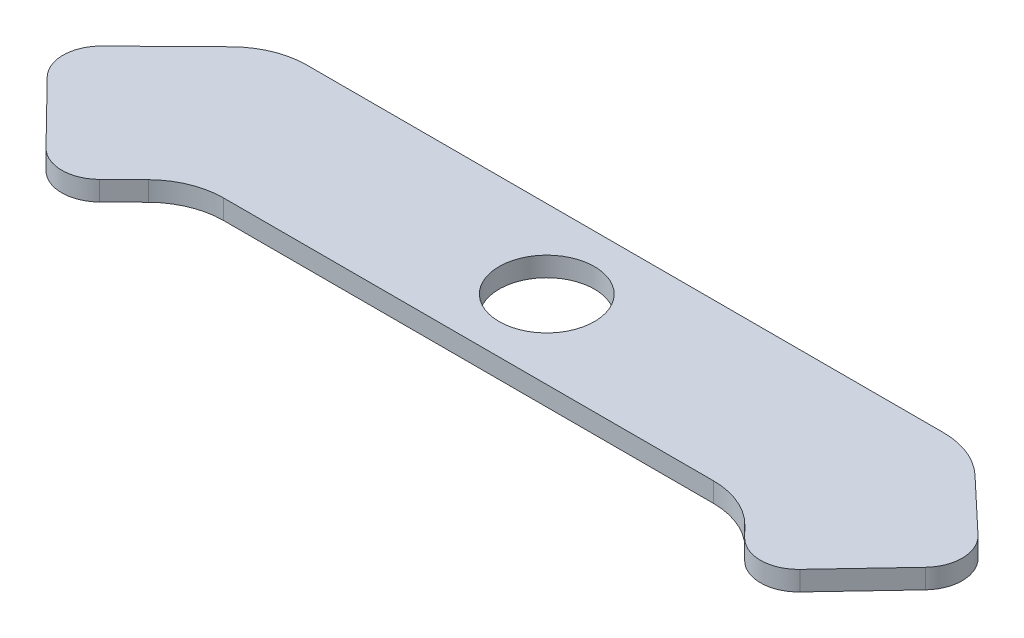
ISO-10303-21;
HEADER;
FILE_DESCRIPTION(('STEP AP214'),'2;1');
FILE_NAME('part.step','',(''),(''),'','','');
FILE_SCHEMA(('AUTOMOTIVE_DESIGN { 1 0 10303 214 1 1 1 1 }'));
ENDSEC;
DATA;
#1=APPLICATION_CONTEXT('core data for automotive mechanical design processes');
#2=APPLICATION_PROTOCOL_DEFINITION('international standard','automotive_design',2000,#1);
#3=PRODUCT_CONTEXT('',#1,'mechanical');
#4=PRODUCT('Part','Part','',(#3));
#5=PRODUCT_RELATED_PRODUCT_CATEGORY('part','',(#4));
#6=PRODUCT_DEFINITION_FORMATION('','',#4);
#7=PRODUCT_DEFINITION_CONTEXT('part definition',#1,'design');
#8=PRODUCT_DEFINITION('design','',#6,#7);
#9=PRODUCT_DEFINITION_SHAPE('','',#8);
#10=(LENGTH_UNIT() NAMED_UNIT(*) SI_UNIT(.MILLI.,.METRE.));
#11=(NAMED_UNIT(*) PLANE_ANGLE_UNIT() SI_UNIT($,.RADIAN.));
#12=(NAMED_UNIT(*) SI_UNIT($,.STERADIAN.) SOLID_ANGLE_UNIT());
#13=UNCERTAINTY_MEASURE_WITH_UNIT(LENGTH_MEASURE(1.E-05),#10,'distance_accuracy_value','');
#14=(GEOMETRIC_REPRESENTATION_CONTEXT(3) GLOBAL_UNCERTAINTY_ASSIGNED_CONTEXT((#13)) GLOBAL_UNIT_ASSIGNED_CONTEXT((#10,
#11,#12)) REPRESENTATION_CONTEXT('',''));
#15=CARTESIAN_POINT('',(0.,0.,0.));
#16=DIRECTION('',(0.,0.,1.));
#17=DIRECTION('',(1.,0.,0.));
#18=AXIS2_PLACEMENT_3D('',#15,#16,#17);
#19=CARTESIAN_POINT('',(34.4461233765753,2.,8.73526015993933));
#20=DIRECTION('',(0.,-1.,0.));
#21=DIRECTION('',(0.,0.,-1.));
#22=AXIS2_PLACEMENT_3D('',#19,#20,#21);
#23=CYLINDRICAL_SURFACE('',#22,3.89449955634084);
#24=CARTESIAN_POINT('',(34.4461233765753,0.,8.73526015993933));
#25=DIRECTION('',(0.,1.,0.));
#26=DIRECTION('',(0.,0.,1.));
#27=AXIS2_PLACEMENT_3D('',#24,#25,#26);
#28=CIRCLE('',#27,3.89449955634084);
#29=CARTESIAN_POINT('',(37.2780702909554,0.,11.4086855784748));
#30=VERTEX_POINT('',#29);
#31=CARTESIAN_POINT('',(31.6648943919165,0.,11.4614098493792));
#32=VERTEX_POINT('',#31);
#33=EDGE_CURVE('E246',#30,#32,#28,.F.);
#34=ORIENTED_EDGE('',*,*,#33,.F.);
#35=DIRECTION('',(0.,-1.,0.));
#36=VECTOR('',#35,1.);
#37=CARTESIAN_POINT('',(37.2780702909554,2.,11.4086855784748));
#38=LINE('',#37,#36);
#39=CARTESIAN_POINT('',(37.2780702909554,2.,11.4086855784748));
#40=VERTEX_POINT('',#39);
#41=EDGE_CURVE('E11',#40,#30,#38,.T.);
#42=ORIENTED_EDGE('',*,*,#41,.F.);
#43=CARTESIAN_POINT('',(34.4461233765753,2.,8.73526015993933));
#44=DIRECTION('',(0.,1.,0.));
#45=DIRECTION('',(0.,0.,1.));
#46=AXIS2_PLACEMENT_3D('',#43,#44,#45);
#47=CIRCLE('',#46,3.89449955634084);
#48=CARTESIAN_POINT('',(31.6648943919165,2.,11.4614098493792));
#49=VERTEX_POINT('',#48);
#50=EDGE_CURVE('E375',#40,#49,#47,.F.);
#51=ORIENTED_EDGE('',*,*,#50,.T.);
#52=DIRECTION('',(0.,-1.,0.));
#53=VECTOR('',#52,1.);
#54=CARTESIAN_POINT('',(31.6648943919165,2.,11.4614098493792));
#55=LINE('',#54,#53);
#56=EDGE_CURVE('E119',#49,#32,#55,.T.);
#57=ORIENTED_EDGE('',*,*,#56,.T.);
#58=EDGE_LOOP('',(#34,#42,#51,#57));
#59=FACE_BOUND('',#58,.T.);
#60=ADVANCED_FACE('F43',(#59),#23,.T.);
#61=CARTESIAN_POINT('',(25.4064211540455,2.,23.9842674177068));
#62=DIRECTION('',(-0.727165807419162,0.,-0.686461862393271));
#63=DIRECTION('',(-0.686461862393271,0.,0.727165807419162));
#64=AXIS2_PLACEMENT_3D('',#61,#62,#63);
#65=PLANE('',#64);
#66=DIRECTION('',(0.686461862393271,0.,-0.727165807419162));
#67=VECTOR('',#66,1.);
#68=CARTESIAN_POINT('',(25.4064211540455,0.,23.9842674177068));
#69=LINE('',#68,#67);
#70=CARTESIAN_POINT('',(43.5001435988416,0.,4.8176727216554));
#71=VERTEX_POINT('',#70);
#72=EDGE_CURVE('E243',#30,#71,#69,.T.);
#73=ORIENTED_EDGE('',*,*,#72,.T.);
#74=DIRECTION('',(0.,-1.,0.));
#75=VECTOR('',#74,1.);
#76=CARTESIAN_POINT('',(43.5001435988416,2.,4.8176727216554));
#77=LINE('',#76,#75);
#78=CARTESIAN_POINT('',(43.5001435988416,2.,4.8176727216554));
#79=VERTEX_POINT('',#78);
#80=EDGE_CURVE('E53',#79,#71,#77,.T.);
#81=ORIENTED_EDGE('',*,*,#80,.F.);
#82=DIRECTION('',(0.686461862393271,0.,-0.727165807419162));
#83=VECTOR('',#82,1.);
#84=CARTESIAN_POINT('',(25.4064211540455,2.,23.9842674177068));
#85=LINE('',#84,#83);
#86=EDGE_CURVE('E378',#40,#79,#85,.T.);
#87=ORIENTED_EDGE('',*,*,#86,.F.);
#88=ORIENTED_EDGE('',*,*,#41,.T.);
#89=EDGE_LOOP('',(#73,#81,#87,#88));
#90=FACE_BOUND('',#89,.T.);
#91=ADVANCED_FACE('F244',(#90),#65,.F.);
#92=CARTESIAN_POINT('',(40.6681966844614,2.,2.14424730311987));
#93=DIRECTION('',(0.,-1.,0.));
#94=DIRECTION('',(0.,0.,-1.));
#95=AXIS2_PLACEMENT_3D('',#92,#93,#94);
#96=CYLINDRICAL_SURFACE('',#95,3.89449955634084);
#97=CARTESIAN_POINT('',(40.6681966844614,0.,2.14424730311987));
#98=DIRECTION('',(0.,1.,0.));
#99=DIRECTION('',(0.,0.,1.));
#100=AXIS2_PLACEMENT_3D('',#97,#98,#99);
#101=CIRCLE('',#100,3.89449955634084);
#102=CARTESIAN_POINT('',(43.3416221029969,0.,-0.687699611260275));
#103=VERTEX_POINT('',#102);
#104=EDGE_CURVE('E237',#103,#71,#101,.F.);
#105=ORIENTED_EDGE('',*,*,#104,.F.);
#106=DIRECTION('',(0.,-1.,0.));
#107=VECTOR('',#106,1.);
#108=CARTESIAN_POINT('',(43.3416221029969,2.,-0.687699611260275));
#109=LINE('',#108,#107);
#110=CARTESIAN_POINT('',(43.3416221029969,2.,-0.687699611260275));
#111=VERTEX_POINT('',#110);
#112=EDGE_CURVE('E227',#111,#103,#109,.T.);
#113=ORIENTED_EDGE('',*,*,#112,.F.);
#114=CARTESIAN_POINT('',(40.6681966844614,2.,2.14424730311987));
#115=DIRECTION('',(0.,1.,0.));
#116=DIRECTION('',(0.,0.,1.));
#117=AXIS2_PLACEMENT_3D('',#114,#115,#116);
#118=CIRCLE('',#117,3.89449955634084);
#119=EDGE_CURVE('E240',#111,#79,#118,.F.);
#120=ORIENTED_EDGE('',*,*,#119,.T.);
#121=ORIENTED_EDGE('',*,*,#80,.T.);
#122=EDGE_LOOP('',(#105,#113,#120,#121));
#123=FACE_BOUND('',#122,.T.);
#124=ADVANCED_FACE('F235',(#123),#96,.T.);
#125=CARTESIAN_POINT('',(20.7671478633316,2.,-21.9985416104315));
#126=DIRECTION('',(0.68646186239327,0.,-0.727165807419163));
#127=DIRECTION('',(-0.727165807419163,0.,-0.68646186239327));
#128=AXIS2_PLACEMENT_3D('',#125,#126,#127);
#129=PLANE('',#128);
#130=DIRECTION('',(0.727165807419163,0.,0.68646186239327));
#131=VECTOR('',#130,1.);
#132=CARTESIAN_POINT('',(20.7671478633316,0.,-21.9985416104315));
#133=LINE('',#132,#131);
#134=CARTESIAN_POINT('',(37.8468508370623,0.,-5.87489471608208));
#135=VERTEX_POINT('',#134);
#136=EDGE_CURVE('E251',#135,#103,#133,.T.);
#137=ORIENTED_EDGE('',*,*,#136,.F.);
#138=DIRECTION('',(0.,-1.,0.));
#139=VECTOR('',#138,1.);
#140=CARTESIAN_POINT('',(37.8468508370623,2.,-5.87489471608208));
#141=LINE('',#140,#139);
#142=CARTESIAN_POINT('',(37.8468508370623,2.,-5.87489471608208));
#143=VERTEX_POINT('',#142);
#144=EDGE_CURVE('E224',#143,#135,#141,.T.);
#145=ORIENTED_EDGE('',*,*,#144,.F.);
#146=DIRECTION('',(0.727165807419163,0.,0.68646186239327));
#147=VECTOR('',#146,1.);
#148=CARTESIAN_POINT('',(20.7671478633316,2.,-21.9985416104315));
#149=LINE('',#148,#147);
#150=EDGE_CURVE('E385',#143,#111,#149,.T.);
#151=ORIENTED_EDGE('',*,*,#150,.T.);
#152=ORIENTED_EDGE('',*,*,#112,.T.);
#153=EDGE_LOOP('',(#137,#145,#151,#152));
#154=FACE_BOUND('',#153,.T.);
#155=ADVANCED_FACE('F316',(#154),#129,.T.);
#156=CARTESIAN_POINT('',(32.5,2.,-0.211000887330933));
#157=DIRECTION('',(0.,-1.,0.));
#158=DIRECTION('',(0.,0.,-1.));
#159=AXIS2_PLACEMENT_3D('',#156,#157,#158);
#160=CYLINDRICAL_SURFACE('',#159,7.78899911266906);
#161=CARTESIAN_POINT('',(32.5,0.,-0.211000887330933));
#162=DIRECTION('',(0.,1.,0.));
#163=DIRECTION('',(0.,0.,1.));
#164=AXIS2_PLACEMENT_3D('',#161,#162,#163);
#165=CIRCLE('',#164,7.78899911266906);
#166=CARTESIAN_POINT('',(32.5,0.,-7.99999999999999));
#167=VERTEX_POINT('',#166);
#168=EDGE_CURVE('E255',#167,#135,#165,.F.);
#169=ORIENTED_EDGE('',*,*,#168,.F.);
#170=DIRECTION('',(0.,-1.,0.));
#171=VECTOR('',#170,1.);
#172=CARTESIAN_POINT('',(32.5,2.,-7.99999999999999));
#173=LINE('',#172,#171);
#174=CARTESIAN_POINT('',(32.5,2.,-7.99999999999999));
#175=VERTEX_POINT('',#174);
#176=EDGE_CURVE('E221',#175,#167,#173,.T.);
#177=ORIENTED_EDGE('',*,*,#176,.F.);
#178=CARTESIAN_POINT('',(32.5,2.,-0.211000887330933));
#179=DIRECTION('',(0.,1.,0.));
#180=DIRECTION('',(0.,0.,1.));
#181=AXIS2_PLACEMENT_3D('',#178,#179,#180);
#182=CIRCLE('',#181,7.78899911266906);
#183=EDGE_CURVE('E389',#175,#143,#182,.F.);
#184=ORIENTED_EDGE('',*,*,#183,.T.);
#185=ORIENTED_EDGE('',*,*,#144,.T.);
#186=EDGE_LOOP('',(#169,#177,#184,#185));
#187=FACE_BOUND('',#186,.T.);
#188=ADVANCED_FACE('F319',(#187),#160,.T.);
#189=CARTESIAN_POINT('',(0.,2.,-7.99999999999999));
#190=DIRECTION('',(0.,0.,1.));
#191=DIRECTION('',(1.,0.,0.));
#192=AXIS2_PLACEMENT_3D('',#189,#190,#191);
#193=PLANE('',#192);
#194=DIRECTION('',(-1.,0.,0.));
#195=VECTOR('',#194,1.);
#196=CARTESIAN_POINT('',(0.,0.,-7.99999999999999));
#197=LINE('',#196,#195);
#198=CARTESIAN_POINT('',(-32.5,0.,-7.99999999999999));
#199=VERTEX_POINT('',#198);
#200=EDGE_CURVE('E261',#167,#199,#197,.T.);
#201=ORIENTED_EDGE('',*,*,#200,.T.);
#202=DIRECTION('',(0.,-1.,0.));
#203=VECTOR('',#202,1.);
#204=CARTESIAN_POINT('',(-32.5,2.,-7.99999999999999));
#205=LINE('',#204,#203);
#206=CARTESIAN_POINT('',(-32.5,2.,-7.99999999999999));
#207=VERTEX_POINT('',#206);
#208=EDGE_CURVE('E217',#207,#199,#205,.T.);
#209=ORIENTED_EDGE('',*,*,#208,.F.);
#210=DIRECTION('',(-1.,0.,0.));
#211=VECTOR('',#210,1.);
#212=CARTESIAN_POINT('',(0.,2.,-7.99999999999999));
#213=LINE('',#212,#211);
#214=EDGE_CURVE('E393',#175,#207,#213,.T.);
#215=ORIENTED_EDGE('',*,*,#214,.F.);
#216=ORIENTED_EDGE('',*,*,#176,.T.);
#217=EDGE_LOOP('',(#201,#209,#215,#216));
#218=FACE_BOUND('',#217,.T.);
#219=ADVANCED_FACE('F323',(#218),#193,.F.);
#220=CARTESIAN_POINT('',(-32.5,2.,-0.211000887330933));
#221=DIRECTION('',(0.,-1.,0.));
#222=DIRECTION('',(0.,0.,-1.));
#223=AXIS2_PLACEMENT_3D('',#220,#221,#222);
#224=CYLINDRICAL_SURFACE('',#223,7.78899911266906);
#225=CARTESIAN_POINT('',(-32.5,0.,-0.211000887330933));
#226=DIRECTION('',(0.,1.,0.));
#227=DIRECTION('',(0.,0.,1.));
#228=AXIS2_PLACEMENT_3D('',#225,#226,#227);
#229=CIRCLE('',#228,7.78899911266906);
#230=CARTESIAN_POINT('',(-37.9522993788708,0.,-5.7734588566395));
#231=VERTEX_POINT('',#230);
#232=EDGE_CURVE('E265',#199,#231,#229,.T.);
#233=ORIENTED_EDGE('',*,*,#232,.T.);
#234=DIRECTION('',(0.,-1.,0.));
#235=VECTOR('',#234,1.);
#236=CARTESIAN_POINT('',(-37.9522993788708,2.,-5.7734588566395));
#237=LINE('',#236,#235);
#238=CARTESIAN_POINT('',(-37.9522993788708,2.,-5.7734588566395));
#239=VERTEX_POINT('',#238);
#240=EDGE_CURVE('E213',#239,#231,#237,.T.);
#241=ORIENTED_EDGE('',*,*,#240,.F.);
#242=CARTESIAN_POINT('',(-32.5,2.,-0.211000887330933));
#243=DIRECTION('',(0.,1.,0.));
#244=DIRECTION('',(0.,0.,1.));
#245=AXIS2_PLACEMENT_3D('',#242,#243,#244);
#246=CIRCLE('',#245,7.78899911266906);
#247=EDGE_CURVE('E397',#207,#239,#246,.T.);
#248=ORIENTED_EDGE('',*,*,#247,.F.);
#249=ORIENTED_EDGE('',*,*,#208,.T.);
#250=EDGE_LOOP('',(#233,#241,#248,#249));
#251=FACE_BOUND('',#250,.T.);
#252=ADVANCED_FACE('F327',(#251),#224,.T.);
#253=CARTESIAN_POINT('',(-21.4827787203515,2.,-21.9168180967825));
#254=DIRECTION('',(0.700000000000316,0.,0.714142842853975));
#255=DIRECTION('',(0.714142842853975,0.,-0.700000000000316));
#256=AXIS2_PLACEMENT_3D('',#253,#254,#255);
#257=PLANE('',#256);
#258=DIRECTION('',(-0.714142842853975,0.,0.700000000000316));
#259=VECTOR('',#258,1.);
#260=CARTESIAN_POINT('',(-21.4827787203515,0.,-21.9168180967825));
#261=LINE('',#260,#259);
#262=CARTESIAN_POINT('',(-44.6487967692777,0.,0.790421493338897));
#263=VERTEX_POINT('',#262);
#264=EDGE_CURVE('E269',#231,#263,#261,.T.);
#265=ORIENTED_EDGE('',*,*,#264,.T.);
#266=DIRECTION('',(0.,-1.,0.));
#267=VECTOR('',#266,1.);
#268=CARTESIAN_POINT('',(-44.6487967692777,2.,0.790421493338897));
#269=LINE('',#268,#267);
#270=CARTESIAN_POINT('',(-44.6487967692777,2.,0.790421493338897));
#271=VERTEX_POINT('',#270);
#272=EDGE_CURVE('E209',#271,#263,#269,.T.);
#273=ORIENTED_EDGE('',*,*,#272,.F.);
#274=DIRECTION('',(-0.714142842853975,0.,0.700000000000316));
#275=VECTOR('',#274,1.);
#276=CARTESIAN_POINT('',(-21.4827787203515,2.,-21.9168180967825));
#277=LINE('',#276,#275);
#278=EDGE_CURVE('E401',#239,#271,#277,.T.);
#279=ORIENTED_EDGE('',*,*,#278,.F.);
#280=ORIENTED_EDGE('',*,*,#240,.T.);
#281=EDGE_LOOP('',(#265,#273,#279,#280));
#282=FACE_BOUND('',#281,.T.);
#283=ADVANCED_FACE('F331',(#282),#257,.F.);
#284=CARTESIAN_POINT('',(-41.9226470798379,2.,3.57165047799767));
#285=DIRECTION('',(0.,-1.,0.));
#286=DIRECTION('',(0.,0.,-1.));
#287=AXIS2_PLACEMENT_3D('',#284,#285,#286);
#288=CYLINDRICAL_SURFACE('',#287,3.89449955634082);
#289=CARTESIAN_POINT('',(-41.9226470798379,0.,3.57165047799767));
#290=DIRECTION('',(0.,1.,0.));
#291=DIRECTION('',(0.,0.,1.));
#292=AXIS2_PLACEMENT_3D('',#289,#290,#291);
#293=CIRCLE('',#292,3.89449955634082);
#294=CARTESIAN_POINT('',(-44.7038760644967,0.,6.29780016743747));
#295=VERTEX_POINT('',#294);
#296=EDGE_CURVE('E273',#263,#295,#293,.T.);
#297=ORIENTED_EDGE('',*,*,#296,.T.);
#298=DIRECTION('',(0.,-1.,0.));
#299=VECTOR('',#298,1.);
#300=CARTESIAN_POINT('',(-44.7038760644967,2.,6.29780016743747));
#301=LINE('',#300,#299);
#302=CARTESIAN_POINT('',(-44.7038760644967,2.,6.29780016743747));
#303=VERTEX_POINT('',#302);
#304=EDGE_CURVE('E205',#303,#295,#301,.T.);
#305=ORIENTED_EDGE('',*,*,#304,.F.);
#306=CARTESIAN_POINT('',(-41.9226470798379,2.,3.57165047799767));
#307=DIRECTION('',(0.,1.,0.));
#308=DIRECTION('',(0.,0.,1.));
#309=AXIS2_PLACEMENT_3D('',#306,#307,#308);
#310=CIRCLE('',#309,3.89449955634082);
#311=EDGE_CURVE('E405',#271,#303,#310,.T.);
#312=ORIENTED_EDGE('',*,*,#311,.F.);
#313=ORIENTED_EDGE('',*,*,#272,.T.);
#314=EDGE_LOOP('',(#297,#305,#312,#313));
#315=FACE_BOUND('',#314,.T.);
#316=ADVANCED_FACE('F335',(#315),#288,.T.);
#317=CARTESIAN_POINT('',(-25.9472470335849,2.,25.4333892795612));
#318=DIRECTION('',(0.714142842853975,0.,-0.700000000000316));
#319=DIRECTION('',(-0.700000000000316,0.,-0.714142842853975));
#320=AXIS2_PLACEMENT_3D('',#317,#318,#319);
#321=PLANE('',#320);
#322=DIRECTION('',(0.700000000000316,0.,0.714142842853975));
#323=VECTOR('',#322,1.);
#324=CARTESIAN_POINT('',(-25.9472470335849,0.,25.4333892795612));
#325=LINE('',#324,#323);
#326=CARTESIAN_POINT('',(-38.4827756034048,0.,12.6445921230979));
#327=VERTEX_POINT('',#326);
#328=EDGE_CURVE('E277',#295,#327,#325,.T.);
#329=ORIENTED_EDGE('',*,*,#328,.T.);
#330=DIRECTION('',(0.,-1.,0.));
#331=VECTOR('',#330,1.);
#332=CARTESIAN_POINT('',(-38.4827756034048,2.,12.6445921230979));
#333=LINE('',#332,#331);
#334=CARTESIAN_POINT('',(-38.4827756034048,2.,12.6445921230979));
#335=VERTEX_POINT('',#334);
#336=EDGE_CURVE('E201',#335,#327,#333,.T.);
#337=ORIENTED_EDGE('',*,*,#336,.F.);
#338=DIRECTION('',(0.700000000000316,0.,0.714142842853975));
#339=VECTOR('',#338,1.);
#340=CARTESIAN_POINT('',(-25.9472470335849,2.,25.4333892795612));
#341=LINE('',#340,#339);
#342=EDGE_CURVE('E409',#303,#335,#341,.T.);
#343=ORIENTED_EDGE('',*,*,#342,.F.);
#344=ORIENTED_EDGE('',*,*,#304,.T.);
#345=EDGE_LOOP('',(#329,#337,#343,#344));
#346=FACE_BOUND('',#345,.T.);
#347=ADVANCED_FACE('F339',(#346),#321,.F.);
#348=CARTESIAN_POINT('',(-35.701546618746,2.,9.91844243365809));
#349=DIRECTION('',(0.,-1.,0.));
#350=DIRECTION('',(0.,0.,-1.));
#351=AXIS2_PLACEMENT_3D('',#348,#349,#350);
#352=CYLINDRICAL_SURFACE('',#351,3.89449955634082);
#353=CARTESIAN_POINT('',(-35.701546618746,0.,9.91844243365809));
#354=DIRECTION('',(0.,1.,0.));
#355=DIRECTION('',(0.,0.,1.));
#356=AXIS2_PLACEMENT_3D('',#353,#354,#355);
#357=CIRCLE('',#356,3.89449955634082);
#358=CARTESIAN_POINT('',(-32.9753969293062,0.,12.6996714183169));
#359=VERTEX_POINT('',#358);
#360=EDGE_CURVE('E281',#327,#359,#357,.T.);
#361=ORIENTED_EDGE('',*,*,#360,.T.);
#362=DIRECTION('',(0.,-1.,0.));
#363=VECTOR('',#362,1.);
#364=CARTESIAN_POINT('',(-32.9753969293062,2.,12.6996714183169));
#365=LINE('',#364,#363);
#366=CARTESIAN_POINT('',(-32.9753969293062,2.,12.6996714183169));
#367=VERTEX_POINT('',#366);
#368=EDGE_CURVE('E197',#367,#359,#365,.T.);
#369=ORIENTED_EDGE('',*,*,#368,.F.);
#370=CARTESIAN_POINT('',(-35.701546618746,2.,9.91844243365809));
#371=DIRECTION('',(0.,1.,0.));
#372=DIRECTION('',(0.,0.,1.));
#373=AXIS2_PLACEMENT_3D('',#370,#371,#372);
#374=CIRCLE('',#373,3.89449955634082);
#375=EDGE_CURVE('E413',#335,#367,#374,.T.);
#376=ORIENTED_EDGE('',*,*,#375,.F.);
#377=ORIENTED_EDGE('',*,*,#336,.T.);
#378=EDGE_LOOP('',(#361,#369,#376,#377));
#379=FACE_BOUND('',#378,.T.);
#380=ADVANCED_FACE('F343',(#379),#352,.T.);
#381=CARTESIAN_POINT('',(-9.80937888038005,2.,-10.0075681718046));
#382=DIRECTION('',(-0.700000000000316,0.,-0.714142842853975));
#383=DIRECTION('',(-0.714142842853975,0.,0.700000000000316));
#384=AXIS2_PLACEMENT_3D('',#381,#382,#383);
#385=PLANE('',#384);
#386=DIRECTION('',(0.714142842853975,0.,-0.700000000000316));
#387=VECTOR('',#386,1.);
#388=CARTESIAN_POINT('',(-9.80937888038005,0.,-10.0075681718046));
#389=LINE('',#388,#387);
#390=CARTESIAN_POINT('',(-30.4522993788708,0.,10.2265411433605));
#391=VERTEX_POINT('',#390);
#392=EDGE_CURVE('E285',#359,#391,#389,.T.);
#393=ORIENTED_EDGE('',*,*,#392,.T.);
#394=DIRECTION('',(0.,-1.,0.));
#395=VECTOR('',#394,1.);
#396=CARTESIAN_POINT('',(-30.4522993788708,2.,10.2265411433605));
#397=LINE('',#396,#395);
#398=CARTESIAN_POINT('',(-30.4522993788708,2.,10.2265411433605));
#399=VERTEX_POINT('',#398);
#400=EDGE_CURVE('E190',#399,#391,#397,.T.);
#401=ORIENTED_EDGE('',*,*,#400,.F.);
#402=DIRECTION('',(0.714142842853975,0.,-0.700000000000316));
#403=VECTOR('',#402,1.);
#404=CARTESIAN_POINT('',(-9.80937888038005,2.,-10.0075681718046));
#405=LINE('',#404,#403);
#406=EDGE_CURVE('E417',#367,#399,#405,.T.);
#407=ORIENTED_EDGE('',*,*,#406,.F.);
#408=ORIENTED_EDGE('',*,*,#368,.T.);
#409=EDGE_LOOP('',(#393,#401,#407,#408));
#410=FACE_BOUND('',#409,.T.);
#411=ADVANCED_FACE('F347',(#410),#385,.F.);
#412=CARTESIAN_POINT('',(-25.,2.,15.7889991126691));
#413=DIRECTION('',(0.,-1.,0.));
#414=DIRECTION('',(0.,0.,-1.));
#415=AXIS2_PLACEMENT_3D('',#412,#413,#414);
#416=CYLINDRICAL_SURFACE('',#415,7.78899911266906);
#417=CARTESIAN_POINT('',(-25.,0.,15.7889991126691));
#418=DIRECTION('',(0.,1.,0.));
#419=DIRECTION('',(0.,0.,1.));
#420=AXIS2_PLACEMENT_3D('',#417,#418,#419);
#421=CIRCLE('',#420,7.78899911266906);
#422=CARTESIAN_POINT('',(-25.,0.,8.));
#423=VERTEX_POINT('',#422);
#424=EDGE_CURVE('E289',#423,#391,#421,.T.);
#425=ORIENTED_EDGE('',*,*,#424,.F.);
#426=DIRECTION('',(0.,-1.,0.));
#427=VECTOR('',#426,1.);
#428=CARTESIAN_POINT('',(-25.,2.,8.));
#429=LINE('',#428,#427);
#430=CARTESIAN_POINT('',(-25.,2.,8.));
#431=VERTEX_POINT('',#430);
#432=EDGE_CURVE('E186',#431,#423,#429,.T.);
#433=ORIENTED_EDGE('',*,*,#432,.F.);
#434=CARTESIAN_POINT('',(-25.,2.,15.7889991126691));
#435=DIRECTION('',(0.,1.,0.));
#436=DIRECTION('',(0.,0.,1.));
#437=AXIS2_PLACEMENT_3D('',#434,#435,#436);
#438=CIRCLE('',#437,7.78899911266906);
#439=EDGE_CURVE('E178',#431,#399,#438,.T.);
#440=ORIENTED_EDGE('',*,*,#439,.T.);
#441=ORIENTED_EDGE('',*,*,#400,.T.);
#442=EDGE_LOOP('',(#425,#433,#440,#441));
#443=FACE_BOUND('',#442,.T.);
#444=ADVANCED_FACE('F351',(#443),#416,.F.);
#445=CARTESIAN_POINT('',(0.,2.,8.));
#446=DIRECTION('',(0.,0.,-1.));
#447=DIRECTION('',(-1.,0.,0.));
#448=AXIS2_PLACEMENT_3D('',#445,#446,#447);
#449=PLANE('',#448);
#450=DIRECTION('',(1.,0.,0.));
#451=VECTOR('',#450,1.);
#452=CARTESIAN_POINT('',(0.,0.,8.));
#453=LINE('',#452,#451);
#454=CARTESIAN_POINT('',(25.,0.,7.99999999999999));
#455=VERTEX_POINT('',#454);
#456=EDGE_CURVE('E184',#423,#455,#453,.T.);
#457=ORIENTED_EDGE('',*,*,#456,.T.);
#458=DIRECTION('',(0.,-1.,0.));
#459=VECTOR('',#458,1.);
#460=CARTESIAN_POINT('',(25.,2.,7.99999999999999));
#461=LINE('',#460,#459);
#462=CARTESIAN_POINT('',(25.,2.,7.99999999999999));
#463=VERTEX_POINT('',#462);
#464=EDGE_CURVE('E168',#463,#455,#461,.T.);
#465=ORIENTED_EDGE('',*,*,#464,.F.);
#466=DIRECTION('',(1.,0.,0.));
#467=VECTOR('',#466,1.);
#468=CARTESIAN_POINT('',(0.,2.,8.));
#469=LINE('',#468,#467);
#470=EDGE_CURVE('E172',#431,#463,#469,.T.);
#471=ORIENTED_EDGE('',*,*,#470,.F.);
#472=ORIENTED_EDGE('',*,*,#432,.T.);
#473=EDGE_LOOP('',(#457,#465,#471,#472));
#474=FACE_BOUND('',#473,.T.);
#475=ADVANCED_FACE('F182',(#474),#449,.F.);
#476=CARTESIAN_POINT('',(25.,2.,15.7889991126691));
#477=DIRECTION('',(0.,-1.,0.));
#478=DIRECTION('',(0.,0.,-1.));
#479=AXIS2_PLACEMENT_3D('',#476,#477,#478);
#480=CYLINDRICAL_SURFACE('',#479,7.78899911266906);
#481=CARTESIAN_POINT('',(25.,0.,15.7889991126691));
#482=DIRECTION('',(0.,1.,0.));
#483=DIRECTION('',(0.,0.,1.));
#484=AXIS2_PLACEMENT_3D('',#481,#482,#483);
#485=CIRCLE('',#484,7.78899911266906);
#486=CARTESIAN_POINT('',(30.5624579693086,0.,10.3366997337982));
#487=VERTEX_POINT('',#486);
#488=EDGE_CURVE('E295',#455,#487,#485,.F.);
#489=ORIENTED_EDGE('',*,*,#488,.T.);
#490=DIRECTION('',(0.,-1.,0.));
#491=VECTOR('',#490,1.);
#492=CARTESIAN_POINT('',(30.5624579693086,2.,10.3366997337982));
#493=LINE('',#492,#491);
#494=CARTESIAN_POINT('',(30.5624579693086,2.,10.3366997337982));
#495=VERTEX_POINT('',#494);
#496=EDGE_CURVE('E170',#495,#487,#493,.T.);
#497=ORIENTED_EDGE('',*,*,#496,.F.);
#498=CARTESIAN_POINT('',(25.,2.,15.7889991126691));
#499=DIRECTION('',(0.,1.,0.));
#500=DIRECTION('',(0.,0.,1.));
#501=AXIS2_PLACEMENT_3D('',#498,#499,#500);
#502=CIRCLE('',#501,7.78899911266906);
#503=EDGE_CURVE('E163',#463,#495,#502,.F.);
#504=ORIENTED_EDGE('',*,*,#503,.F.);
#505=ORIENTED_EDGE('',*,*,#464,.T.);
#506=EDGE_LOOP('',(#489,#497,#504,#505));
#507=FACE_BOUND('',#506,.T.);
#508=ADVANCED_FACE('F166',(#507),#480,.F.);
#509=CARTESIAN_POINT('',(0.,2.,0.));
#510=DIRECTION('',(0.,-1.,0.));
#511=DIRECTION('',(0.,0.,-1.));
#512=AXIS2_PLACEMENT_3D('',#509,#510,#511);
#513=CYLINDRICAL_SURFACE('',#512,4.8681244454261);
#514=CARTESIAN_POINT('',(0.,2.,0.));
#515=DIRECTION('',(0.,1.,0.));
#516=DIRECTION('',(0.,0.,1.));
#517=AXIS2_PLACEMENT_3D('',#514,#515,#516);
#518=CIRCLE('',#517,4.8681244454261);
#519=CARTESIAN_POINT('',(0.,2.,4.8681244454261));
#520=VERTEX_POINT('',#519);
#521=EDGE_CURVE('E299',#520,#520,#518,.T.);
#522=ORIENTED_EDGE('',*,*,#521,.T.);
#523=EDGE_LOOP('',(#522));
#524=FACE_BOUND('',#523,.T.);
#525=CARTESIAN_POINT('',(0.,0.,0.));
#526=DIRECTION('',(0.,1.,0.));
#527=DIRECTION('',(0.,0.,1.));
#528=AXIS2_PLACEMENT_3D('',#525,#526,#527);
#529=CIRCLE('',#528,4.8681244454261);
#530=CARTESIAN_POINT('',(0.,0.,4.8681244454261));
#531=VERTEX_POINT('',#530);
#532=EDGE_CURVE('E304',#531,#531,#529,.T.);
#533=ORIENTED_EDGE('',*,*,#532,.F.);
#534=EDGE_LOOP('',(#533));
#535=FACE_BOUND('',#534,.T.);
#536=ADVANCED_FACE('F45',(#524,#535),#513,.F.);
#537=CARTESIAN_POINT('',(10.4195374707957,2.,-10.2131895636062));
#538=DIRECTION('',(0.714142842853975,0.,-0.700000000000316));
#539=DIRECTION('',(-0.700000000000316,0.,-0.714142842853975));
#540=AXIS2_PLACEMENT_3D('',#537,#538,#539);
#541=PLANE('',#540);
#542=DIRECTION('',(0.700000000000316,0.,0.714142842853975));
#543=VECTOR('',#542,1.);
#544=CARTESIAN_POINT('',(10.4195374707957,0.,-10.2131895636062));
#545=LINE('',#544,#543);
#546=EDGE_CURVE('E112',#487,#32,#545,.T.);
#547=ORIENTED_EDGE('',*,*,#546,.T.);
#548=ORIENTED_EDGE('',*,*,#56,.F.);
#549=DIRECTION('',(0.700000000000316,0.,0.714142842853975));
#550=VECTOR('',#549,1.);
#551=CARTESIAN_POINT('',(10.4195374707957,2.,-10.2131895636062));
#552=LINE('',#551,#550);
#553=EDGE_CURVE('E61',#495,#49,#552,.T.);
#554=ORIENTED_EDGE('',*,*,#553,.F.);
#555=ORIENTED_EDGE('',*,*,#496,.T.);
#556=EDGE_LOOP('',(#547,#548,#554,#555));
#557=FACE_BOUND('',#556,.T.);
#558=ADVANCED_FACE('F360',(#557),#541,.F.);
#559=CARTESIAN_POINT('',(0.,2.,0.));
#560=DIRECTION('',(0.,1.,0.));
#561=DIRECTION('',(0.,0.,1.));
#562=AXIS2_PLACEMENT_3D('',#559,#560,#561);
#563=PLANE('',#562);
#564=ORIENTED_EDGE('',*,*,#521,.F.);
#565=EDGE_LOOP('',(#564));
#566=FACE_BOUND('',#565,.T.);
#567=ORIENTED_EDGE('',*,*,#50,.F.);
#568=ORIENTED_EDGE('',*,*,#86,.T.);
#569=ORIENTED_EDGE('',*,*,#119,.F.);
#570=ORIENTED_EDGE('',*,*,#150,.F.);
#571=ORIENTED_EDGE('',*,*,#183,.F.);
#572=ORIENTED_EDGE('',*,*,#214,.T.);
#573=ORIENTED_EDGE('',*,*,#247,.T.);
#574=ORIENTED_EDGE('',*,*,#278,.T.);
#575=ORIENTED_EDGE('',*,*,#311,.T.);
#576=ORIENTED_EDGE('',*,*,#342,.T.);
#577=ORIENTED_EDGE('',*,*,#375,.T.);
#578=ORIENTED_EDGE('',*,*,#406,.T.);
#579=ORIENTED_EDGE('',*,*,#439,.F.);
#580=ORIENTED_EDGE('',*,*,#470,.T.);
#581=ORIENTED_EDGE('',*,*,#503,.T.);
#582=ORIENTED_EDGE('',*,*,#553,.T.);
#583=EDGE_LOOP('',(#567,#568,#569,#570,#571,#572,#573,#574,#575,#576,#577,#578,#579,#580,#581,#582));
#584=FACE_BOUND('',#583,.T.);
#585=ADVANCED_FACE('F176',(#566,#584),#563,.T.);
#586=CARTESIAN_POINT('',(0.,0.,0.));
#587=DIRECTION('',(0.,1.,0.));
#588=DIRECTION('',(0.,0.,1.));
#589=AXIS2_PLACEMENT_3D('',#586,#587,#588);
#590=PLANE('',#589);
#591=ORIENTED_EDGE('',*,*,#532,.T.);
#592=EDGE_LOOP('',(#591));
#593=FACE_BOUND('',#592,.T.);
#594=ORIENTED_EDGE('',*,*,#33,.T.);
#595=ORIENTED_EDGE('',*,*,#546,.F.);
#596=ORIENTED_EDGE('',*,*,#488,.F.);
#597=ORIENTED_EDGE('',*,*,#456,.F.);
#598=ORIENTED_EDGE('',*,*,#424,.T.);
#599=ORIENTED_EDGE('',*,*,#392,.F.);
#600=ORIENTED_EDGE('',*,*,#360,.F.);
#601=ORIENTED_EDGE('',*,*,#328,.F.);
#602=ORIENTED_EDGE('',*,*,#296,.F.);
#603=ORIENTED_EDGE('',*,*,#264,.F.);
#604=ORIENTED_EDGE('',*,*,#232,.F.);
#605=ORIENTED_EDGE('',*,*,#200,.F.);
#606=ORIENTED_EDGE('',*,*,#168,.T.);
#607=ORIENTED_EDGE('',*,*,#136,.T.);
#608=ORIENTED_EDGE('',*,*,#104,.T.);
#609=ORIENTED_EDGE('',*,*,#72,.F.);
#610=EDGE_LOOP('',(#594,#595,#596,#597,#598,#599,#600,#601,#602,#603,#604,#605,#606,#607,#608,#609));
#611=FACE_BOUND('',#610,.T.);
#612=ADVANCED_FACE('F248',(#593,#611),#590,.F.);
#613=CLOSED_SHELL('',(#60,#91,#124,#155,#188,#219,#252,#283,#316,#347,#380,#411,#444,#475,#508,
#536,#558,#585,#612));
#614=MANIFOLD_SOLID_BREP('B2',#613);
#615=ADVANCED_BREP_SHAPE_REPRESENTATION('',(#18,#614),#14);
#616=SHAPE_DEFINITION_REPRESENTATION(#9,#615);
ENDSEC;
END-ISO-10303-21;
